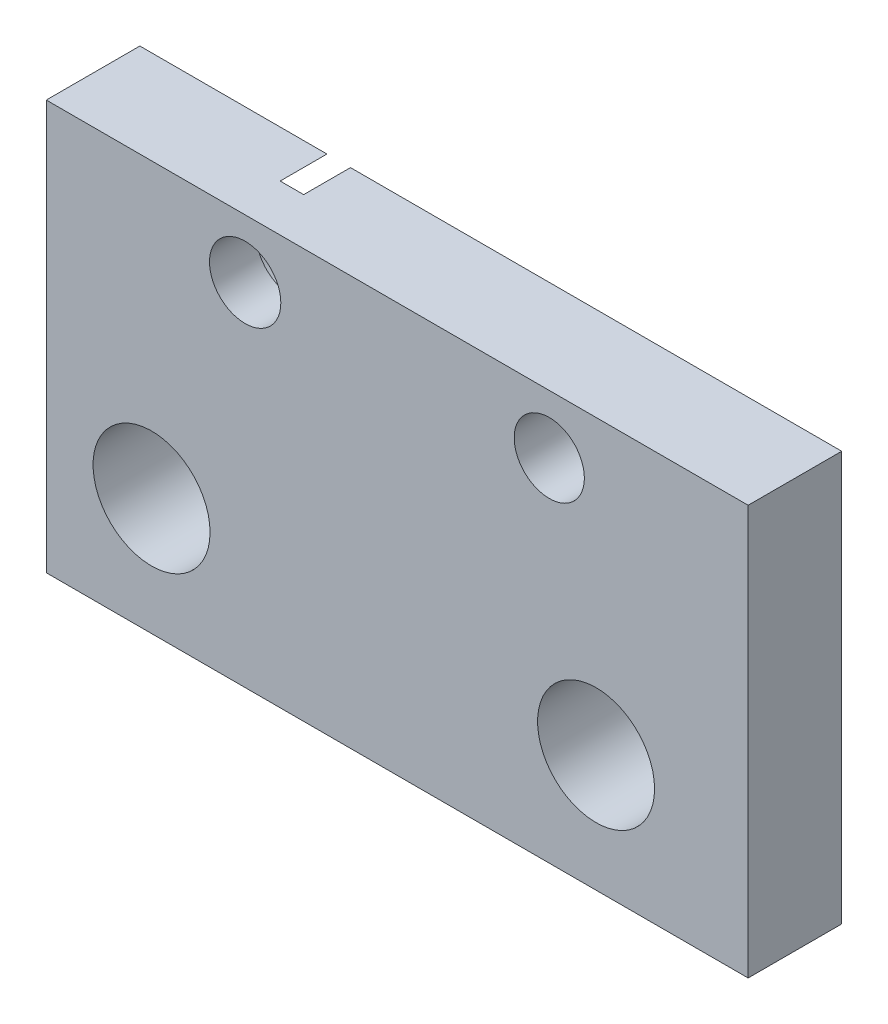
ISO-10303-21;
HEADER;
FILE_DESCRIPTION(('STEP AP214'),'2;1');
FILE_NAME('part.step','',(''),(''),'','','');
FILE_SCHEMA(('AUTOMOTIVE_DESIGN { 1 0 10303 214 1 1 1 1 }'));
ENDSEC;
DATA;
#1=APPLICATION_CONTEXT('core data for automotive mechanical design processes');
#2=APPLICATION_PROTOCOL_DEFINITION('international standard','automotive_design',2000,#1);
#3=PRODUCT_CONTEXT('',#1,'mechanical');
#4=PRODUCT('Part','Part','',(#3));
#5=PRODUCT_RELATED_PRODUCT_CATEGORY('part','',(#4));
#6=PRODUCT_DEFINITION_FORMATION('','',#4);
#7=PRODUCT_DEFINITION_CONTEXT('part definition',#1,'design');
#8=PRODUCT_DEFINITION('design','',#6,#7);
#9=PRODUCT_DEFINITION_SHAPE('','',#8);
#10=(LENGTH_UNIT() NAMED_UNIT(*) SI_UNIT(.MILLI.,.METRE.));
#11=(NAMED_UNIT(*) PLANE_ANGLE_UNIT() SI_UNIT($,.RADIAN.));
#12=(NAMED_UNIT(*) SI_UNIT($,.STERADIAN.) SOLID_ANGLE_UNIT());
#13=UNCERTAINTY_MEASURE_WITH_UNIT(LENGTH_MEASURE(1.E-05),#10,'distance_accuracy_value','');
#14=(GEOMETRIC_REPRESENTATION_CONTEXT(3) GLOBAL_UNCERTAINTY_ASSIGNED_CONTEXT((#13)) GLOBAL_UNIT_ASSIGNED_CONTEXT((#10,
#11,#12)) REPRESENTATION_CONTEXT('',''));
#15=CARTESIAN_POINT('',(0.,0.,0.));
#16=DIRECTION('',(0.,0.,1.));
#17=DIRECTION('',(1.,0.,0.));
#18=AXIS2_PLACEMENT_3D('',#15,#16,#17);
#19=CARTESIAN_POINT('',(-13.,20.,0.));
#20=DIRECTION('',(0.,0.,1.));
#21=DIRECTION('',(1.,0.,0.));
#22=AXIS2_PLACEMENT_3D('',#19,#20,#21);
#23=CYLINDRICAL_SURFACE('',#22,3.05);
#24=CARTESIAN_POINT('',(-13.,20.,8.));
#25=DIRECTION('',(0.,0.,1.));
#26=DIRECTION('',(1.,0.,0.));
#27=AXIS2_PLACEMENT_3D('',#24,#25,#26);
#28=CIRCLE('',#27,3.05);
#29=CARTESIAN_POINT('',(-9.95,20.,8.));
#30=VERTEX_POINT('',#29);
#31=EDGE_CURVE('E110',#30,#30,#28,.T.);
#32=ORIENTED_EDGE('',*,*,#31,.T.);
#33=EDGE_LOOP('',(#32));
#34=FACE_BOUND('',#33,.T.);
#35=CARTESIAN_POINT('',(-13.,20.,4.));
#36=DIRECTION('',(0.,0.,-1.));
#37=DIRECTION('',(-1.,0.,0.));
#38=AXIS2_PLACEMENT_3D('',#35,#36,#37);
#39=CIRCLE('',#38,3.05);
#40=CARTESIAN_POINT('',(-16.05,20.,4.));
#41=VERTEX_POINT('',#40);
#42=EDGE_CURVE('E37',#41,#41,#39,.F.);
#43=ORIENTED_EDGE('',*,*,#42,.F.);
#44=EDGE_LOOP('',(#43));
#45=FACE_BOUND('',#44,.T.);
#46=ADVANCED_FACE('F33',(#34,#45),#23,.F.);
#47=CARTESIAN_POINT('',(-30.,-10.,8.));
#48=DIRECTION('',(-1.,0.,0.));
#49=DIRECTION('',(0.,0.,1.));
#50=AXIS2_PLACEMENT_3D('',#47,#48,#49);
#51=PLANE('',#50);
#52=DIRECTION('',(0.,0.,-1.));
#53=VECTOR('',#52,1.);
#54=CARTESIAN_POINT('',(-30.,-10.,8.));
#55=LINE('',#54,#53);
#56=CARTESIAN_POINT('',(-30.,-10.,8.));
#57=VERTEX_POINT('',#56);
#58=CARTESIAN_POINT('',(-30.,-10.,0.));
#59=VERTEX_POINT('',#58);
#60=EDGE_CURVE('E11',#57,#59,#55,.T.);
#61=ORIENTED_EDGE('',*,*,#60,.F.);
#62=DIRECTION('',(0.,1.,0.));
#63=VECTOR('',#62,1.);
#64=CARTESIAN_POINT('',(-30.,-10.,8.));
#65=LINE('',#64,#63);
#66=CARTESIAN_POINT('',(-30.,25.,8.));
#67=VERTEX_POINT('',#66);
#68=EDGE_CURVE('E119',#57,#67,#65,.T.);
#69=ORIENTED_EDGE('',*,*,#68,.T.);
#70=DIRECTION('',(0.,0.,-1.));
#71=VECTOR('',#70,1.);
#72=CARTESIAN_POINT('',(-30.,25.,8.));
#73=LINE('',#72,#71);
#74=CARTESIAN_POINT('',(-30.,25.,0.));
#75=VERTEX_POINT('',#74);
#76=EDGE_CURVE('E130',#67,#75,#73,.T.);
#77=ORIENTED_EDGE('',*,*,#76,.T.);
#78=DIRECTION('',(0.,1.,0.));
#79=VECTOR('',#78,1.);
#80=CARTESIAN_POINT('',(-30.,-10.,0.));
#81=LINE('',#80,#79);
#82=EDGE_CURVE('E106',#59,#75,#81,.T.);
#83=ORIENTED_EDGE('',*,*,#82,.F.);
#84=EDGE_LOOP('',(#61,#69,#77,#83));
#85=FACE_BOUND('',#84,.T.);
#86=ADVANCED_FACE('F140',(#85),#51,.T.);
#87=CARTESIAN_POINT('',(-30.,-10.,8.));
#88=DIRECTION('',(0.,1.,0.));
#89=DIRECTION('',(0.,0.,1.));
#90=AXIS2_PLACEMENT_3D('',#87,#88,#89);
#91=PLANE('',#90);
#92=DIRECTION('',(0.,0.,-1.));
#93=VECTOR('',#92,1.);
#94=CARTESIAN_POINT('',(30.,-10.,8.));
#95=LINE('',#94,#93);
#96=CARTESIAN_POINT('',(30.,-10.,8.));
#97=VERTEX_POINT('',#96);
#98=CARTESIAN_POINT('',(30.,-10.,0.));
#99=VERTEX_POINT('',#98);
#100=EDGE_CURVE('E42',#97,#99,#95,.T.);
#101=ORIENTED_EDGE('',*,*,#100,.F.);
#102=DIRECTION('',(1.,0.,0.));
#103=VECTOR('',#102,1.);
#104=CARTESIAN_POINT('',(-30.,-10.,8.));
#105=LINE('',#104,#103);
#106=EDGE_CURVE('E127',#57,#97,#105,.T.);
#107=ORIENTED_EDGE('',*,*,#106,.F.);
#108=ORIENTED_EDGE('',*,*,#60,.T.);
#109=DIRECTION('',(1.,0.,0.));
#110=VECTOR('',#109,1.);
#111=CARTESIAN_POINT('',(-30.,-10.,0.));
#112=LINE('',#111,#110);
#113=EDGE_CURVE('E116',#59,#99,#112,.T.);
#114=ORIENTED_EDGE('',*,*,#113,.T.);
#115=EDGE_LOOP('',(#101,#107,#108,#114));
#116=FACE_BOUND('',#115,.T.);
#117=ADVANCED_FACE('F35',(#116),#91,.F.);
#118=CARTESIAN_POINT('',(30.,25.,8.));
#119=DIRECTION('',(1.,0.,0.));
#120=DIRECTION('',(0.,0.,-1.));
#121=AXIS2_PLACEMENT_3D('',#118,#119,#120);
#122=PLANE('',#121);
#123=DIRECTION('',(0.,0.,-1.));
#124=VECTOR('',#123,1.);
#125=CARTESIAN_POINT('',(30.,25.,8.));
#126=LINE('',#125,#124);
#127=CARTESIAN_POINT('',(30.,25.,8.));
#128=VERTEX_POINT('',#127);
#129=CARTESIAN_POINT('',(30.,25.,0.));
#130=VERTEX_POINT('',#129);
#131=EDGE_CURVE('E132',#128,#130,#126,.T.);
#132=ORIENTED_EDGE('',*,*,#131,.F.);
#133=DIRECTION('',(0.,-1.,0.));
#134=VECTOR('',#133,1.);
#135=CARTESIAN_POINT('',(30.,25.,8.));
#136=LINE('',#135,#134);
#137=EDGE_CURVE('E124',#128,#97,#136,.T.);
#138=ORIENTED_EDGE('',*,*,#137,.T.);
#139=ORIENTED_EDGE('',*,*,#100,.T.);
#140=DIRECTION('',(0.,-1.,0.));
#141=VECTOR('',#140,1.);
#142=CARTESIAN_POINT('',(30.,25.,0.));
#143=LINE('',#142,#141);
#144=EDGE_CURVE('E109',#130,#99,#143,.T.);
#145=ORIENTED_EDGE('',*,*,#144,.F.);
#146=EDGE_LOOP('',(#132,#138,#139,#145));
#147=FACE_BOUND('',#146,.T.);
#148=ADVANCED_FACE('F136',(#147),#122,.T.);
#149=CARTESIAN_POINT('',(30.,25.,8.));
#150=DIRECTION('',(0.,-1.,0.));
#151=DIRECTION('',(0.,0.,-1.));
#152=AXIS2_PLACEMENT_3D('',#149,#150,#151);
#153=PLANE('',#152);
#154=DIRECTION('',(1.,0.,0.));
#155=VECTOR('',#154,1.);
#156=CARTESIAN_POINT('',(30.,25.,4.));
#157=LINE('',#156,#155);
#158=CARTESIAN_POINT('',(-14.0049875621121,25.,4.));
#159=VERTEX_POINT('',#158);
#160=CARTESIAN_POINT('',(-11.9950124378879,25.,4.));
#161=VERTEX_POINT('',#160);
#162=EDGE_CURVE('E100',#159,#161,#157,.T.);
#163=ORIENTED_EDGE('',*,*,#162,.F.);
#164=DIRECTION('',(0.,0.,-1.));
#165=VECTOR('',#164,1.);
#166=CARTESIAN_POINT('',(-14.0049875621121,25.,4.));
#167=LINE('',#166,#165);
#168=CARTESIAN_POINT('',(-14.0049875621121,25.,0.));
#169=VERTEX_POINT('',#168);
#170=EDGE_CURVE('E87',#159,#169,#167,.T.);
#171=ORIENTED_EDGE('',*,*,#170,.T.);
#172=DIRECTION('',(-1.,0.,0.));
#173=VECTOR('',#172,1.);
#174=CARTESIAN_POINT('',(30.,25.,0.));
#175=LINE('',#174,#173);
#176=EDGE_CURVE('E98',#169,#75,#175,.T.);
#177=ORIENTED_EDGE('',*,*,#176,.T.);
#178=ORIENTED_EDGE('',*,*,#76,.F.);
#179=DIRECTION('',(-1.,0.,0.));
#180=VECTOR('',#179,1.);
#181=CARTESIAN_POINT('',(30.,25.,8.));
#182=LINE('',#181,#180);
#183=EDGE_CURVE('E121',#128,#67,#182,.T.);
#184=ORIENTED_EDGE('',*,*,#183,.F.);
#185=ORIENTED_EDGE('',*,*,#131,.T.);
#186=CARTESIAN_POINT('',(-11.9950124378879,25.,0.));
#187=VERTEX_POINT('',#186);
#188=EDGE_CURVE('E107',#130,#187,#175,.T.);
#189=ORIENTED_EDGE('',*,*,#188,.T.);
#190=DIRECTION('',(0.,0.,-1.));
#191=VECTOR('',#190,1.);
#192=CARTESIAN_POINT('',(-11.9950124378879,25.,4.));
#193=LINE('',#192,#191);
#194=EDGE_CURVE('E49',#187,#161,#193,.F.);
#195=ORIENTED_EDGE('',*,*,#194,.T.);
#196=EDGE_LOOP('',(#163,#171,#177,#178,#184,#185,#189,#195));
#197=FACE_BOUND('',#196,.T.);
#198=ADVANCED_FACE('F97',(#197),#153,.F.);
#199=CARTESIAN_POINT('',(-30.,25.,8.));
#200=DIRECTION('',(0.,0.,1.));
#201=DIRECTION('',(1.,0.,0.));
#202=AXIS2_PLACEMENT_3D('',#199,#200,#201);
#203=PLANE('',#202);
#204=CARTESIAN_POINT('',(17.,0.,8.));
#205=DIRECTION('',(0.,0.,1.));
#206=DIRECTION('',(1.,0.,0.));
#207=AXIS2_PLACEMENT_3D('',#204,#205,#206);
#208=CIRCLE('',#207,5.);
#209=CARTESIAN_POINT('',(22.,0.,8.));
#210=VERTEX_POINT('',#209);
#211=EDGE_CURVE('E101',#210,#210,#208,.T.);
#212=ORIENTED_EDGE('',*,*,#211,.F.);
#213=EDGE_LOOP('',(#212));
#214=FACE_BOUND('',#213,.T.);
#215=CARTESIAN_POINT('',(-21.,0.,8.));
#216=DIRECTION('',(0.,0.,1.));
#217=DIRECTION('',(1.,0.,0.));
#218=AXIS2_PLACEMENT_3D('',#215,#216,#217);
#219=CIRCLE('',#218,5.);
#220=CARTESIAN_POINT('',(-16.,0.,8.));
#221=VERTEX_POINT('',#220);
#222=EDGE_CURVE('E198',#221,#221,#219,.T.);
#223=ORIENTED_EDGE('',*,*,#222,.F.);
#224=EDGE_LOOP('',(#223));
#225=FACE_BOUND('',#224,.T.);
#226=CARTESIAN_POINT('',(13.,20.,8.));
#227=DIRECTION('',(0.,0.,1.));
#228=DIRECTION('',(1.,0.,0.));
#229=AXIS2_PLACEMENT_3D('',#226,#227,#228);
#230=CIRCLE('',#229,3.);
#231=CARTESIAN_POINT('',(16.,20.,8.));
#232=VERTEX_POINT('',#231);
#233=EDGE_CURVE('E204',#232,#232,#230,.T.);
#234=ORIENTED_EDGE('',*,*,#233,.F.);
#235=EDGE_LOOP('',(#234));
#236=FACE_BOUND('',#235,.T.);
#237=ORIENTED_EDGE('',*,*,#31,.F.);
#238=EDGE_LOOP('',(#237));
#239=FACE_BOUND('',#238,.T.);
#240=ORIENTED_EDGE('',*,*,#68,.F.);
#241=ORIENTED_EDGE('',*,*,#106,.T.);
#242=ORIENTED_EDGE('',*,*,#137,.F.);
#243=ORIENTED_EDGE('',*,*,#183,.T.);
#244=EDGE_LOOP('',(#240,#241,#242,#243));
#245=FACE_BOUND('',#244,.T.);
#246=ADVANCED_FACE('F143',(#214,#225,#236,#239,#245),#203,.T.);
#247=CARTESIAN_POINT('',(-30.,25.,0.));
#248=DIRECTION('',(0.,0.,1.));
#249=DIRECTION('',(1.,0.,0.));
#250=AXIS2_PLACEMENT_3D('',#247,#248,#249);
#251=PLANE('',#250);
#252=CARTESIAN_POINT('',(17.,0.,0.));
#253=DIRECTION('',(0.,0.,1.));
#254=DIRECTION('',(1.,0.,0.));
#255=AXIS2_PLACEMENT_3D('',#252,#253,#254);
#256=CIRCLE('',#255,5.);
#257=CARTESIAN_POINT('',(22.,0.,0.));
#258=VERTEX_POINT('',#257);
#259=EDGE_CURVE('E195',#258,#258,#256,.T.);
#260=ORIENTED_EDGE('',*,*,#259,.T.);
#261=EDGE_LOOP('',(#260));
#262=FACE_BOUND('',#261,.T.);
#263=CARTESIAN_POINT('',(-21.,0.,0.));
#264=DIRECTION('',(0.,0.,1.));
#265=DIRECTION('',(1.,0.,0.));
#266=AXIS2_PLACEMENT_3D('',#263,#264,#265);
#267=CIRCLE('',#266,5.);
#268=CARTESIAN_POINT('',(-16.,0.,0.));
#269=VERTEX_POINT('',#268);
#270=EDGE_CURVE('E201',#269,#269,#267,.T.);
#271=ORIENTED_EDGE('',*,*,#270,.T.);
#272=EDGE_LOOP('',(#271));
#273=FACE_BOUND('',#272,.T.);
#274=CARTESIAN_POINT('',(13.,20.,0.));
#275=DIRECTION('',(0.,0.,1.));
#276=DIRECTION('',(1.,0.,0.));
#277=AXIS2_PLACEMENT_3D('',#274,#275,#276);
#278=CIRCLE('',#277,3.);
#279=CARTESIAN_POINT('',(16.,20.,0.));
#280=VERTEX_POINT('',#279);
#281=EDGE_CURVE('E207',#280,#280,#278,.T.);
#282=ORIENTED_EDGE('',*,*,#281,.T.);
#283=EDGE_LOOP('',(#282));
#284=FACE_BOUND('',#283,.T.);
#285=ORIENTED_EDGE('',*,*,#176,.F.);
#286=CARTESIAN_POINT('',(-13.,20.,0.));
#287=DIRECTION('',(0.,0.,-1.));
#288=DIRECTION('',(-1.,0.,0.));
#289=AXIS2_PLACEMENT_3D('',#286,#287,#288);
#290=CIRCLE('',#289,5.1);
#291=EDGE_CURVE('E84',#187,#169,#290,.T.);
#292=ORIENTED_EDGE('',*,*,#291,.F.);
#293=ORIENTED_EDGE('',*,*,#188,.F.);
#294=ORIENTED_EDGE('',*,*,#144,.T.);
#295=ORIENTED_EDGE('',*,*,#113,.F.);
#296=ORIENTED_EDGE('',*,*,#82,.T.);
#297=EDGE_LOOP('',(#285,#292,#293,#294,#295,#296));
#298=FACE_BOUND('',#297,.T.);
#299=ADVANCED_FACE('F104',(#262,#273,#284,#298),#251,.F.);
#300=CARTESIAN_POINT('',(13.,20.,0.));
#301=DIRECTION('',(0.,0.,1.));
#302=DIRECTION('',(1.,0.,0.));
#303=AXIS2_PLACEMENT_3D('',#300,#301,#302);
#304=CYLINDRICAL_SURFACE('',#303,3.);
#305=ORIENTED_EDGE('',*,*,#281,.F.);
#306=EDGE_LOOP('',(#305));
#307=FACE_BOUND('',#306,.T.);
#308=ORIENTED_EDGE('',*,*,#233,.T.);
#309=EDGE_LOOP('',(#308));
#310=FACE_BOUND('',#309,.T.);
#311=ADVANCED_FACE('F151',(#307,#310),#304,.F.);
#312=CARTESIAN_POINT('',(-21.,0.,0.));
#313=DIRECTION('',(0.,0.,1.));
#314=DIRECTION('',(1.,0.,0.));
#315=AXIS2_PLACEMENT_3D('',#312,#313,#314);
#316=CYLINDRICAL_SURFACE('',#315,5.);
#317=ORIENTED_EDGE('',*,*,#270,.F.);
#318=EDGE_LOOP('',(#317));
#319=FACE_BOUND('',#318,.T.);
#320=ORIENTED_EDGE('',*,*,#222,.T.);
#321=EDGE_LOOP('',(#320));
#322=FACE_BOUND('',#321,.T.);
#323=ADVANCED_FACE('F170',(#319,#322),#316,.F.);
#324=CARTESIAN_POINT('',(17.,0.,0.));
#325=DIRECTION('',(0.,0.,1.));
#326=DIRECTION('',(1.,0.,0.));
#327=AXIS2_PLACEMENT_3D('',#324,#325,#326);
#328=CYLINDRICAL_SURFACE('',#327,5.);
#329=ORIENTED_EDGE('',*,*,#259,.F.);
#330=EDGE_LOOP('',(#329));
#331=FACE_BOUND('',#330,.T.);
#332=ORIENTED_EDGE('',*,*,#211,.T.);
#333=EDGE_LOOP('',(#332));
#334=FACE_BOUND('',#333,.T.);
#335=ADVANCED_FACE('F174',(#331,#334),#328,.F.);
#336=CARTESIAN_POINT('',(-13.,20.,4.));
#337=DIRECTION('',(0.,0.,-1.));
#338=DIRECTION('',(-1.,0.,0.));
#339=AXIS2_PLACEMENT_3D('',#336,#337,#338);
#340=CYLINDRICAL_SURFACE('',#339,5.1);
#341=CARTESIAN_POINT('',(-13.,20.,4.));
#342=DIRECTION('',(0.,0.,-1.));
#343=DIRECTION('',(-1.,0.,0.));
#344=AXIS2_PLACEMENT_3D('',#341,#342,#343);
#345=CIRCLE('',#344,5.1);
#346=EDGE_CURVE('E93',#161,#159,#345,.T.);
#347=ORIENTED_EDGE('',*,*,#346,.F.);
#348=ORIENTED_EDGE('',*,*,#194,.F.);
#349=ORIENTED_EDGE('',*,*,#291,.T.);
#350=ORIENTED_EDGE('',*,*,#170,.F.);
#351=EDGE_LOOP('',(#347,#348,#349,#350));
#352=FACE_BOUND('',#351,.T.);
#353=ADVANCED_FACE('F86',(#352),#340,.F.);
#354=CARTESIAN_POINT('',(-13.,20.,4.));
#355=DIRECTION('',(0.,0.,-1.));
#356=DIRECTION('',(-1.,0.,0.));
#357=AXIS2_PLACEMENT_3D('',#354,#355,#356);
#358=PLANE('',#357);
#359=ORIENTED_EDGE('',*,*,#42,.T.);
#360=EDGE_LOOP('',(#359));
#361=FACE_BOUND('',#360,.T.);
#362=ORIENTED_EDGE('',*,*,#162,.T.);
#363=ORIENTED_EDGE('',*,*,#346,.T.);
#364=EDGE_LOOP('',(#362,#363));
#365=FACE_BOUND('',#364,.T.);
#366=ADVANCED_FACE('F181',(#361,#365),#358,.T.);
#367=CLOSED_SHELL('',(#46,#86,#117,#148,#198,#246,#299,#311,#323,#335,#353,#366));
#368=MANIFOLD_SOLID_BREP('B2',#367);
#369=ADVANCED_BREP_SHAPE_REPRESENTATION('',(#18,#368),#14);
#370=SHAPE_DEFINITION_REPRESENTATION(#9,#369);
ENDSEC;
END-ISO-10303-21;
